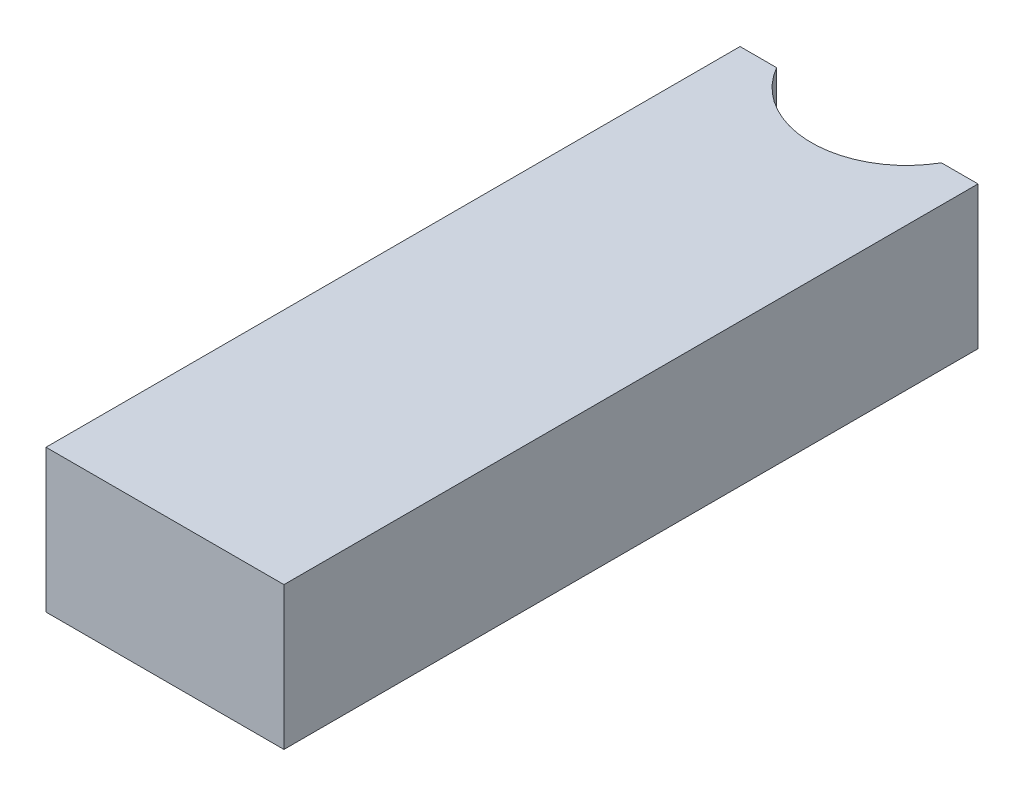
ISO-10303-21;
HEADER;
FILE_DESCRIPTION(('STEP AP214'),'2;1');
FILE_NAME('part.step','',(''),(''),'','','');
FILE_SCHEMA(('AUTOMOTIVE_DESIGN { 1 0 10303 214 1 1 1 1 }'));
ENDSEC;
DATA;
#1=APPLICATION_CONTEXT('core data for automotive mechanical design processes');
#2=APPLICATION_PROTOCOL_DEFINITION('international standard','automotive_design',2000,#1);
#3=PRODUCT_CONTEXT('',#1,'mechanical');
#4=PRODUCT('Part','Part','',(#3));
#5=PRODUCT_RELATED_PRODUCT_CATEGORY('part','',(#4));
#6=PRODUCT_DEFINITION_FORMATION('','',#4);
#7=PRODUCT_DEFINITION_CONTEXT('part definition',#1,'design');
#8=PRODUCT_DEFINITION('design','',#6,#7);
#9=PRODUCT_DEFINITION_SHAPE('','',#8);
#10=(LENGTH_UNIT() NAMED_UNIT(*) SI_UNIT(.MILLI.,.METRE.));
#11=(NAMED_UNIT(*) PLANE_ANGLE_UNIT() SI_UNIT($,.RADIAN.));
#12=(NAMED_UNIT(*) SI_UNIT($,.STERADIAN.) SOLID_ANGLE_UNIT());
#13=UNCERTAINTY_MEASURE_WITH_UNIT(LENGTH_MEASURE(1.E-05),#10,'distance_accuracy_value','');
#14=(GEOMETRIC_REPRESENTATION_CONTEXT(3) GLOBAL_UNCERTAINTY_ASSIGNED_CONTEXT((#13)) GLOBAL_UNIT_ASSIGNED_CONTEXT((#10,
#11,#12)) REPRESENTATION_CONTEXT('',''));
#15=CARTESIAN_POINT('',(0.,0.,0.));
#16=DIRECTION('',(0.,0.,1.));
#17=DIRECTION('',(1.,0.,0.));
#18=AXIS2_PLACEMENT_3D('',#15,#16,#17);
#19=CARTESIAN_POINT('',(0.,0.,0.));
#20=DIRECTION('',(0.,0.,1.));
#21=DIRECTION('',(1.,0.,0.));
#22=AXIS2_PLACEMENT_3D('',#19,#20,#21);
#23=PLANE('',#22);
#24=DIRECTION('',(1.,0.,0.));
#25=VECTOR('',#24,1.);
#26=CARTESIAN_POINT('',(-15.875,-9.525,0.));
#27=LINE('',#26,#25);
#28=CARTESIAN_POINT('',(10.9985226280624,-9.525,0.));
#29=VERTEX_POINT('',#28);
#30=CARTESIAN_POINT('',(15.875,-9.525,0.));
#31=VERTEX_POINT('',#30);
#32=EDGE_CURVE('E90',#29,#31,#27,.T.);
#33=ORIENTED_EDGE('',*,*,#32,.F.);
#34=DIRECTION('',(0.,1.,0.));
#35=VECTOR('',#34,1.);
#36=CARTESIAN_POINT('',(10.9985226280624,-9.525,0.));
#37=LINE('',#36,#35);
#38=CARTESIAN_POINT('',(10.9985226280624,9.525,0.));
#39=VERTEX_POINT('',#38);
#40=EDGE_CURVE('E11',#29,#39,#37,.T.);
#41=ORIENTED_EDGE('',*,*,#40,.T.);
#42=DIRECTION('',(-1.,0.,0.));
#43=VECTOR('',#42,1.);
#44=CARTESIAN_POINT('',(-15.875,9.525,0.));
#45=LINE('',#44,#43);
#46=CARTESIAN_POINT('',(15.875,9.525,0.));
#47=VERTEX_POINT('',#46);
#48=EDGE_CURVE('E114',#47,#39,#45,.T.);
#49=ORIENTED_EDGE('',*,*,#48,.F.);
#50=DIRECTION('',(0.,1.,0.));
#51=VECTOR('',#50,1.);
#52=CARTESIAN_POINT('',(15.875,9.525,0.));
#53=LINE('',#52,#51);
#54=EDGE_CURVE('E126',#31,#47,#53,.T.);
#55=ORIENTED_EDGE('',*,*,#54,.F.);
#56=EDGE_LOOP('',(#33,#41,#49,#55));
#57=FACE_BOUND('',#56,.T.);
#58=ADVANCED_FACE('F45',(#57),#23,.F.);
#59=CARTESIAN_POINT('',(15.875,9.525,92.6084));
#60=DIRECTION('',(-1.,0.,0.));
#61=DIRECTION('',(0.,0.,1.));
#62=AXIS2_PLACEMENT_3D('',#59,#60,#61);
#63=PLANE('',#62);
#64=ORIENTED_EDGE('',*,*,#54,.T.);
#65=DIRECTION('',(0.,0.,-1.));
#66=VECTOR('',#65,1.);
#67=CARTESIAN_POINT('',(15.875,9.525,92.6084));
#68=LINE('',#67,#66);
#69=CARTESIAN_POINT('',(15.875,9.525,92.6084));
#70=VERTEX_POINT('',#69);
#71=EDGE_CURVE('E117',#70,#47,#68,.T.);
#72=ORIENTED_EDGE('',*,*,#71,.F.);
#73=DIRECTION('',(0.,1.,0.));
#74=VECTOR('',#73,1.);
#75=CARTESIAN_POINT('',(15.875,9.525,92.6084));
#76=LINE('',#75,#74);
#77=CARTESIAN_POINT('',(15.875,-9.525,92.6084));
#78=VERTEX_POINT('',#77);
#79=EDGE_CURVE('E134',#78,#70,#76,.T.);
#80=ORIENTED_EDGE('',*,*,#79,.F.);
#81=DIRECTION('',(0.,0.,-1.));
#82=VECTOR('',#81,1.);
#83=CARTESIAN_POINT('',(15.875,-9.525,92.6084));
#84=LINE('',#83,#82);
#85=EDGE_CURVE('E135',#78,#31,#84,.T.);
#86=ORIENTED_EDGE('',*,*,#85,.T.);
#87=EDGE_LOOP('',(#64,#72,#80,#86));
#88=FACE_BOUND('',#87,.T.);
#89=ADVANCED_FACE('F47',(#88),#63,.F.);
#90=CARTESIAN_POINT('',(-15.875,9.525,92.6084));
#91=DIRECTION('',(0.,-1.,0.));
#92=DIRECTION('',(0.,0.,-1.));
#93=AXIS2_PLACEMENT_3D('',#90,#91,#92);
#94=PLANE('',#93);
#95=ORIENTED_EDGE('',*,*,#48,.T.);
#96=CARTESIAN_POINT('',(0.,9.525,-6.35));
#97=DIRECTION('',(0.,1.,0.));
#98=DIRECTION('',(0.,0.,1.));
#99=AXIS2_PLACEMENT_3D('',#96,#97,#98);
#100=CIRCLE('',#99,12.7);
#101=CARTESIAN_POINT('',(-10.9985226280624,9.525,0.));
#102=VERTEX_POINT('',#101);
#103=EDGE_CURVE('E106',#102,#39,#100,.T.);
#104=ORIENTED_EDGE('',*,*,#103,.F.);
#105=CARTESIAN_POINT('',(-15.875,9.525,0.));
#106=VERTEX_POINT('',#105);
#107=EDGE_CURVE('E121',#102,#106,#45,.T.);
#108=ORIENTED_EDGE('',*,*,#107,.T.);
#109=DIRECTION('',(0.,0.,-1.));
#110=VECTOR('',#109,1.);
#111=CARTESIAN_POINT('',(-15.875,9.525,92.6084));
#112=LINE('',#111,#110);
#113=CARTESIAN_POINT('',(-15.875,9.525,92.6084));
#114=VERTEX_POINT('',#113);
#115=EDGE_CURVE('E142',#114,#106,#112,.T.);
#116=ORIENTED_EDGE('',*,*,#115,.F.);
#117=DIRECTION('',(-1.,0.,0.));
#118=VECTOR('',#117,1.);
#119=CARTESIAN_POINT('',(-15.875,9.525,92.6084));
#120=LINE('',#119,#118);
#121=EDGE_CURVE('E98',#70,#114,#120,.T.);
#122=ORIENTED_EDGE('',*,*,#121,.F.);
#123=ORIENTED_EDGE('',*,*,#71,.T.);
#124=EDGE_LOOP('',(#95,#104,#108,#116,#122,#123));
#125=FACE_BOUND('',#124,.T.);
#126=ADVANCED_FACE('F115',(#125),#94,.F.);
#127=CARTESIAN_POINT('',(-15.875,9.525,92.6084));
#128=DIRECTION('',(1.,0.,0.));
#129=DIRECTION('',(0.,0.,-1.));
#130=AXIS2_PLACEMENT_3D('',#127,#128,#129);
#131=PLANE('',#130);
#132=DIRECTION('',(0.,-1.,0.));
#133=VECTOR('',#132,1.);
#134=CARTESIAN_POINT('',(-15.875,9.525,0.));
#135=LINE('',#134,#133);
#136=CARTESIAN_POINT('',(-15.875,-9.525,0.));
#137=VERTEX_POINT('',#136);
#138=EDGE_CURVE('E120',#106,#137,#135,.T.);
#139=ORIENTED_EDGE('',*,*,#138,.T.);
#140=DIRECTION('',(0.,0.,-1.));
#141=VECTOR('',#140,1.);
#142=CARTESIAN_POINT('',(-15.875,-9.525,92.6084));
#143=LINE('',#142,#141);
#144=CARTESIAN_POINT('',(-15.875,-9.525,92.6084));
#145=VERTEX_POINT('',#144);
#146=EDGE_CURVE('E138',#145,#137,#143,.T.);
#147=ORIENTED_EDGE('',*,*,#146,.F.);
#148=DIRECTION('',(0.,-1.,0.));
#149=VECTOR('',#148,1.);
#150=CARTESIAN_POINT('',(-15.875,9.525,92.6084));
#151=LINE('',#150,#149);
#152=EDGE_CURVE('E157',#114,#145,#151,.T.);
#153=ORIENTED_EDGE('',*,*,#152,.F.);
#154=ORIENTED_EDGE('',*,*,#115,.T.);
#155=EDGE_LOOP('',(#139,#147,#153,#154));
#156=FACE_BOUND('',#155,.T.);
#157=ADVANCED_FACE('F156',(#156),#131,.F.);
#158=CARTESIAN_POINT('',(-15.875,-9.525,92.6084));
#159=DIRECTION('',(0.,1.,0.));
#160=DIRECTION('',(0.,0.,1.));
#161=AXIS2_PLACEMENT_3D('',#158,#159,#160);
#162=PLANE('',#161);
#163=CARTESIAN_POINT('',(-10.9985226280624,-9.525,0.));
#164=VERTEX_POINT('',#163);
#165=EDGE_CURVE('E130',#137,#164,#27,.T.);
#166=ORIENTED_EDGE('',*,*,#165,.T.);
#167=CARTESIAN_POINT('',(0.,-9.525,-6.35));
#168=DIRECTION('',(0.,1.,0.));
#169=DIRECTION('',(0.,0.,1.));
#170=AXIS2_PLACEMENT_3D('',#167,#168,#169);
#171=CIRCLE('',#170,12.7);
#172=EDGE_CURVE('E61',#164,#29,#171,.T.);
#173=ORIENTED_EDGE('',*,*,#172,.T.);
#174=ORIENTED_EDGE('',*,*,#32,.T.);
#175=ORIENTED_EDGE('',*,*,#85,.F.);
#176=DIRECTION('',(1.,0.,0.));
#177=VECTOR('',#176,1.);
#178=CARTESIAN_POINT('',(-15.875,-9.525,92.6084));
#179=LINE('',#178,#177);
#180=EDGE_CURVE('E70',#145,#78,#179,.T.);
#181=ORIENTED_EDGE('',*,*,#180,.F.);
#182=ORIENTED_EDGE('',*,*,#146,.T.);
#183=EDGE_LOOP('',(#166,#173,#174,#175,#181,#182));
#184=FACE_BOUND('',#183,.T.);
#185=ADVANCED_FACE('F152',(#184),#162,.F.);
#186=CARTESIAN_POINT('',(0.,0.,92.6084));
#187=DIRECTION('',(0.,0.,1.));
#188=DIRECTION('',(1.,0.,0.));
#189=AXIS2_PLACEMENT_3D('',#186,#187,#188);
#190=PLANE('',#189);
#191=ORIENTED_EDGE('',*,*,#79,.T.);
#192=ORIENTED_EDGE('',*,*,#121,.T.);
#193=ORIENTED_EDGE('',*,*,#152,.T.);
#194=ORIENTED_EDGE('',*,*,#180,.T.);
#195=EDGE_LOOP('',(#191,#192,#193,#194));
#196=FACE_BOUND('',#195,.T.);
#197=ADVANCED_FACE('F170',(#196),#190,.T.);
#198=ORIENTED_EDGE('',*,*,#107,.F.);
#199=DIRECTION('',(0.,1.,0.));
#200=VECTOR('',#199,1.);
#201=CARTESIAN_POINT('',(-10.9985226280624,-9.525,0.));
#202=LINE('',#201,#200);
#203=EDGE_CURVE('E54',#102,#164,#202,.F.);
#204=ORIENTED_EDGE('',*,*,#203,.T.);
#205=ORIENTED_EDGE('',*,*,#165,.F.);
#206=ORIENTED_EDGE('',*,*,#138,.F.);
#207=EDGE_LOOP('',(#198,#204,#205,#206));
#208=FACE_BOUND('',#207,.T.);
#209=ADVANCED_FACE('F150',(#208),#23,.F.);
#210=CARTESIAN_POINT('',(0.,-9.525,-6.35));
#211=DIRECTION('',(0.,1.,0.));
#212=DIRECTION('',(0.,0.,1.));
#213=AXIS2_PLACEMENT_3D('',#210,#211,#212);
#214=CYLINDRICAL_SURFACE('',#213,12.7);
#215=ORIENTED_EDGE('',*,*,#172,.F.);
#216=ORIENTED_EDGE('',*,*,#203,.F.);
#217=ORIENTED_EDGE('',*,*,#103,.T.);
#218=ORIENTED_EDGE('',*,*,#40,.F.);
#219=EDGE_LOOP('',(#215,#216,#217,#218));
#220=FACE_BOUND('',#219,.T.);
#221=ADVANCED_FACE('F107',(#220),#214,.F.);
#222=CLOSED_SHELL('',(#58,#89,#126,#157,#185,#197,#209,#221));
#223=MANIFOLD_SOLID_BREP('B2',#222);
#224=ADVANCED_BREP_SHAPE_REPRESENTATION('',(#18,#223),#14);
#225=SHAPE_DEFINITION_REPRESENTATION(#9,#224);
ENDSEC;
END-ISO-10303-21;
